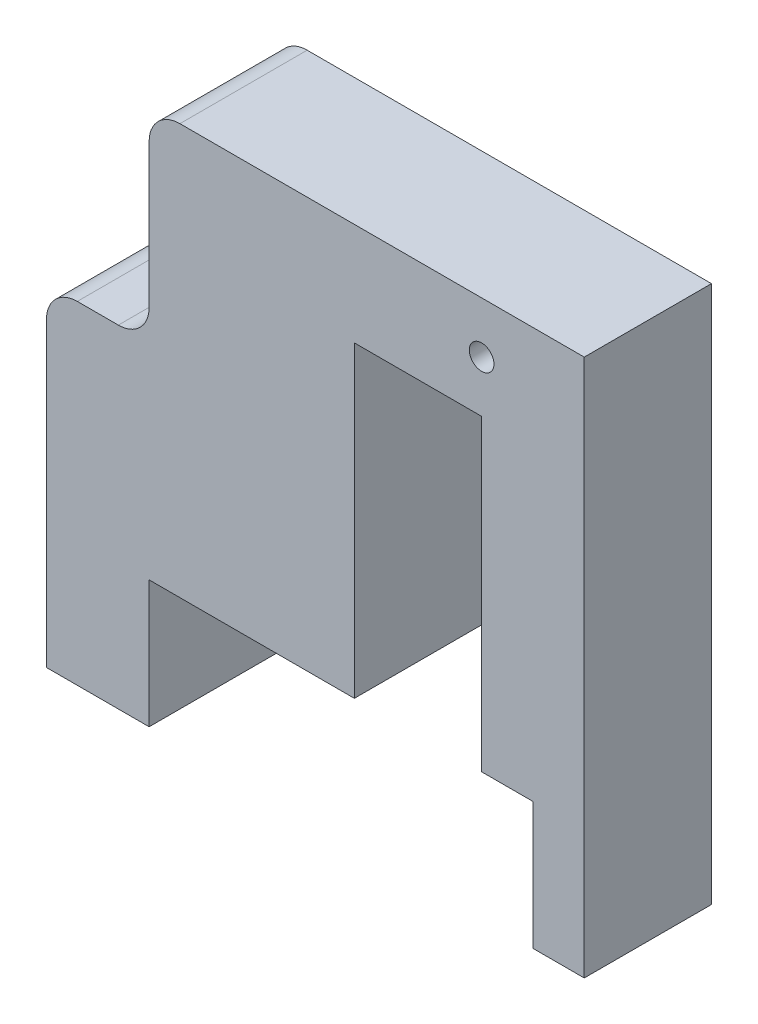
ISO-10303-21;
HEADER;
FILE_DESCRIPTION(('STEP AP214'),'2;1');
FILE_NAME('part.step','',(''),(''),'','','');
FILE_SCHEMA(('AUTOMOTIVE_DESIGN { 1 0 10303 214 1 1 1 1 }'));
ENDSEC;
DATA;
#1=APPLICATION_CONTEXT('core data for automotive mechanical design processes');
#2=APPLICATION_PROTOCOL_DEFINITION('international standard','automotive_design',2000,#1);
#3=PRODUCT_CONTEXT('',#1,'mechanical');
#4=PRODUCT('Part','Part','',(#3));
#5=PRODUCT_RELATED_PRODUCT_CATEGORY('part','',(#4));
#6=PRODUCT_DEFINITION_FORMATION('','',#4);
#7=PRODUCT_DEFINITION_CONTEXT('part definition',#1,'design');
#8=PRODUCT_DEFINITION('design','',#6,#7);
#9=PRODUCT_DEFINITION_SHAPE('','',#8);
#10=(LENGTH_UNIT() NAMED_UNIT(*) SI_UNIT(.MILLI.,.METRE.));
#11=(NAMED_UNIT(*) PLANE_ANGLE_UNIT() SI_UNIT($,.RADIAN.));
#12=(NAMED_UNIT(*) SI_UNIT($,.STERADIAN.) SOLID_ANGLE_UNIT());
#13=UNCERTAINTY_MEASURE_WITH_UNIT(LENGTH_MEASURE(1.E-05),#10,'distance_accuracy_value','');
#14=(GEOMETRIC_REPRESENTATION_CONTEXT(3) GLOBAL_UNCERTAINTY_ASSIGNED_CONTEXT((#13)) GLOBAL_UNIT_ASSIGNED_CONTEXT((#10,
#11,#12)) REPRESENTATION_CONTEXT('',''));
#15=CARTESIAN_POINT('',(0.,0.,0.));
#16=DIRECTION('',(0.,0.,1.));
#17=DIRECTION('',(1.,0.,0.));
#18=AXIS2_PLACEMENT_3D('',#15,#16,#17);
#19=CARTESIAN_POINT('',(3.,29.4,12.4));
#20=DIRECTION('',(0.,0.,1.));
#21=DIRECTION('',(1.,0.,0.));
#22=AXIS2_PLACEMENT_3D('',#19,#20,#21);
#23=PLANE('',#22);
#24=DIRECTION('',(0.,-1.,0.));
#25=VECTOR('',#24,1.);
#26=CARTESIAN_POINT('',(0.,0.,12.4));
#27=LINE('',#26,#25);
#28=CARTESIAN_POINT('',(0.,29.4,12.4));
#29=VERTEX_POINT('',#28);
#30=CARTESIAN_POINT('',(0.,0.,12.4));
#31=VERTEX_POINT('',#30);
#32=EDGE_CURVE('E217',#29,#31,#27,.T.);
#33=ORIENTED_EDGE('',*,*,#32,.T.);
#34=DIRECTION('',(1.,0.,0.));
#35=VECTOR('',#34,1.);
#36=CARTESIAN_POINT('',(0.,0.,12.4));
#37=LINE('',#36,#35);
#38=CARTESIAN_POINT('',(10.,0.,12.4));
#39=VERTEX_POINT('',#38);
#40=EDGE_CURVE('E120',#31,#39,#37,.T.);
#41=ORIENTED_EDGE('',*,*,#40,.T.);
#42=DIRECTION('',(0.,1.,0.));
#43=VECTOR('',#42,1.);
#44=CARTESIAN_POINT('',(10.,0.,12.4));
#45=LINE('',#44,#43);
#46=CARTESIAN_POINT('',(10.,12.4,12.4));
#47=VERTEX_POINT('',#46);
#48=EDGE_CURVE('E259',#39,#47,#45,.T.);
#49=ORIENTED_EDGE('',*,*,#48,.T.);
#50=DIRECTION('',(1.,0.,0.));
#51=VECTOR('',#50,1.);
#52=CARTESIAN_POINT('',(10.,12.4,12.4));
#53=LINE('',#52,#51);
#54=CARTESIAN_POINT('',(30.,12.4,12.4));
#55=VERTEX_POINT('',#54);
#56=EDGE_CURVE('E278',#47,#55,#53,.T.);
#57=ORIENTED_EDGE('',*,*,#56,.T.);
#58=DIRECTION('',(0.,1.,0.));
#59=VECTOR('',#58,1.);
#60=CARTESIAN_POINT('',(30.,12.4,12.4));
#61=LINE('',#60,#59);
#62=CARTESIAN_POINT('',(30.,42.4,12.4));
#63=VERTEX_POINT('',#62);
#64=EDGE_CURVE('E275',#55,#63,#61,.T.);
#65=ORIENTED_EDGE('',*,*,#64,.T.);
#66=DIRECTION('',(1.,0.,0.));
#67=VECTOR('',#66,1.);
#68=CARTESIAN_POINT('',(30.,42.4,12.4));
#69=LINE('',#68,#67);
#70=CARTESIAN_POINT('',(42.4,42.4,12.4));
#71=VERTEX_POINT('',#70);
#72=EDGE_CURVE('E277',#63,#71,#69,.T.);
#73=ORIENTED_EDGE('',*,*,#72,.T.);
#74=DIRECTION('',(0.,-1.,0.));
#75=VECTOR('',#74,1.);
#76=CARTESIAN_POINT('',(42.4,12.4,12.4));
#77=LINE('',#76,#75);
#78=CARTESIAN_POINT('',(42.4,12.4,12.4));
#79=VERTEX_POINT('',#78);
#80=EDGE_CURVE('E280',#71,#79,#77,.T.);
#81=ORIENTED_EDGE('',*,*,#80,.T.);
#82=DIRECTION('',(1.,0.,0.));
#83=VECTOR('',#82,1.);
#84=CARTESIAN_POINT('',(42.4,12.4,12.4));
#85=LINE('',#84,#83);
#86=CARTESIAN_POINT('',(47.4,12.4,12.4));
#87=VERTEX_POINT('',#86);
#88=EDGE_CURVE('E286',#79,#87,#85,.T.);
#89=ORIENTED_EDGE('',*,*,#88,.T.);
#90=DIRECTION('',(0.,-1.,0.));
#91=VECTOR('',#90,1.);
#92=CARTESIAN_POINT('',(47.4,0.,12.4));
#93=LINE('',#92,#91);
#94=CARTESIAN_POINT('',(47.4,0.,12.4));
#95=VERTEX_POINT('',#94);
#96=EDGE_CURVE('E288',#87,#95,#93,.T.);
#97=ORIENTED_EDGE('',*,*,#96,.T.);
#98=DIRECTION('',(1.,0.,0.));
#99=VECTOR('',#98,1.);
#100=CARTESIAN_POINT('',(47.4,0.,12.4));
#101=LINE('',#100,#99);
#102=CARTESIAN_POINT('',(52.4,0.,12.4));
#103=VERTEX_POINT('',#102);
#104=EDGE_CURVE('E290',#95,#103,#101,.T.);
#105=ORIENTED_EDGE('',*,*,#104,.T.);
#106=DIRECTION('',(0.,1.,0.));
#107=VECTOR('',#106,1.);
#108=CARTESIAN_POINT('',(52.4,0.,12.4));
#109=LINE('',#108,#107);
#110=CARTESIAN_POINT('',(52.4,52.4,12.4));
#111=VERTEX_POINT('',#110);
#112=EDGE_CURVE('E292',#103,#111,#109,.T.);
#113=ORIENTED_EDGE('',*,*,#112,.T.);
#114=DIRECTION('',(-1.,0.,0.));
#115=VECTOR('',#114,1.);
#116=CARTESIAN_POINT('',(13.,52.4,12.4));
#117=LINE('',#116,#115);
#118=CARTESIAN_POINT('',(13.,52.4,12.4));
#119=VERTEX_POINT('',#118);
#120=EDGE_CURVE('E294',#111,#119,#117,.T.);
#121=ORIENTED_EDGE('',*,*,#120,.T.);
#122=CARTESIAN_POINT('',(13.,49.4,12.4));
#123=DIRECTION('',(0.,0.,1.));
#124=DIRECTION('',(1.,0.,0.));
#125=AXIS2_PLACEMENT_3D('',#122,#123,#124);
#126=CIRCLE('',#125,3.);
#127=CARTESIAN_POINT('',(10.,49.4,12.4));
#128=VERTEX_POINT('',#127);
#129=EDGE_CURVE('E296',#119,#128,#126,.T.);
#130=ORIENTED_EDGE('',*,*,#129,.T.);
#131=DIRECTION('',(0.,-1.,0.));
#132=VECTOR('',#131,1.);
#133=CARTESIAN_POINT('',(10.,49.4,12.4));
#134=LINE('',#133,#132);
#135=CARTESIAN_POINT('',(10.,35.4,12.4));
#136=VERTEX_POINT('',#135);
#137=EDGE_CURVE('E166',#128,#136,#134,.T.);
#138=ORIENTED_EDGE('',*,*,#137,.T.);
#139=CARTESIAN_POINT('',(7.,35.4,12.4));
#140=DIRECTION('',(0.,0.,-1.));
#141=DIRECTION('',(1.,0.,0.));
#142=AXIS2_PLACEMENT_3D('',#139,#140,#141);
#143=CIRCLE('',#142,3.);
#144=CARTESIAN_POINT('',(7.,32.4,12.4));
#145=VERTEX_POINT('',#144);
#146=EDGE_CURVE('E160',#136,#145,#143,.T.);
#147=ORIENTED_EDGE('',*,*,#146,.T.);
#148=DIRECTION('',(-1.,0.,0.));
#149=VECTOR('',#148,1.);
#150=CARTESIAN_POINT('',(3.,32.4,12.4));
#151=LINE('',#150,#149);
#152=CARTESIAN_POINT('',(3.,32.4,12.4));
#153=VERTEX_POINT('',#152);
#154=EDGE_CURVE('E164',#145,#153,#151,.T.);
#155=ORIENTED_EDGE('',*,*,#154,.T.);
#156=CARTESIAN_POINT('',(3.,29.4,12.4));
#157=DIRECTION('',(0.,0.,1.));
#158=DIRECTION('',(1.,0.,0.));
#159=AXIS2_PLACEMENT_3D('',#156,#157,#158);
#160=CIRCLE('',#159,3.);
#161=EDGE_CURVE('E50',#153,#29,#160,.T.);
#162=ORIENTED_EDGE('',*,*,#161,.T.);
#163=EDGE_LOOP('',(#33,#41,#49,#57,#65,#73,#81,#89,#97,#105,#113,#121,#130,#138,#147,#155,#162));
#164=FACE_BOUND('',#163,.T.);
#165=CARTESIAN_POINT('',(42.4,47.4,12.4));
#166=DIRECTION('',(0.,0.,1.));
#167=DIRECTION('',(1.,0.,0.));
#168=AXIS2_PLACEMENT_3D('',#165,#166,#167);
#169=CIRCLE('',#168,1.19999999999998);
#170=CARTESIAN_POINT('',(41.2,47.4,12.4));
#171=VERTEX_POINT('',#170);
#172=EDGE_CURVE('E188',#171,#171,#169,.T.);
#173=ORIENTED_EDGE('',*,*,#172,.F.);
#174=EDGE_LOOP('',(#173));
#175=FACE_BOUND('',#174,.T.);
#176=ADVANCED_FACE('F33',(#164,#175),#23,.T.);
#177=CARTESIAN_POINT('',(3.,29.4,0.));
#178=DIRECTION('',(0.,0.,1.));
#179=DIRECTION('',(1.,0.,0.));
#180=AXIS2_PLACEMENT_3D('',#177,#178,#179);
#181=PLANE('',#180);
#182=DIRECTION('',(0.,-1.,0.));
#183=VECTOR('',#182,1.);
#184=CARTESIAN_POINT('',(0.,0.,0.));
#185=LINE('',#184,#183);
#186=CARTESIAN_POINT('',(0.,29.4,0.));
#187=VERTEX_POINT('',#186);
#188=CARTESIAN_POINT('',(0.,0.,0.));
#189=VERTEX_POINT('',#188);
#190=EDGE_CURVE('E184',#187,#189,#185,.T.);
#191=ORIENTED_EDGE('',*,*,#190,.F.);
#192=CARTESIAN_POINT('',(3.,29.4,0.));
#193=DIRECTION('',(0.,0.,1.));
#194=DIRECTION('',(1.,0.,0.));
#195=AXIS2_PLACEMENT_3D('',#192,#193,#194);
#196=CIRCLE('',#195,3.);
#197=CARTESIAN_POINT('',(3.,32.4,0.));
#198=VERTEX_POINT('',#197);
#199=EDGE_CURVE('E112',#198,#187,#196,.T.);
#200=ORIENTED_EDGE('',*,*,#199,.F.);
#201=DIRECTION('',(-1.,0.,0.));
#202=VECTOR('',#201,1.);
#203=CARTESIAN_POINT('',(3.,32.4,0.));
#204=LINE('',#203,#202);
#205=CARTESIAN_POINT('',(7.,32.4,0.));
#206=VERTEX_POINT('',#205);
#207=EDGE_CURVE('E106',#206,#198,#204,.T.);
#208=ORIENTED_EDGE('',*,*,#207,.F.);
#209=CARTESIAN_POINT('',(7.,35.4,0.));
#210=DIRECTION('',(0.,0.,-1.));
#211=DIRECTION('',(1.,0.,0.));
#212=AXIS2_PLACEMENT_3D('',#209,#210,#211);
#213=CIRCLE('',#212,3.);
#214=CARTESIAN_POINT('',(10.,35.4,0.));
#215=VERTEX_POINT('',#214);
#216=EDGE_CURVE('E174',#215,#206,#213,.T.);
#217=ORIENTED_EDGE('',*,*,#216,.F.);
#218=DIRECTION('',(0.,-1.,0.));
#219=VECTOR('',#218,1.);
#220=CARTESIAN_POINT('',(10.,49.4,0.));
#221=LINE('',#220,#219);
#222=CARTESIAN_POINT('',(10.,49.4,0.));
#223=VERTEX_POINT('',#222);
#224=EDGE_CURVE('E212',#223,#215,#221,.T.);
#225=ORIENTED_EDGE('',*,*,#224,.F.);
#226=CARTESIAN_POINT('',(13.,49.4,0.));
#227=DIRECTION('',(0.,0.,1.));
#228=DIRECTION('',(1.,0.,0.));
#229=AXIS2_PLACEMENT_3D('',#226,#227,#228);
#230=CIRCLE('',#229,3.);
#231=CARTESIAN_POINT('',(13.,52.4,0.));
#232=VERTEX_POINT('',#231);
#233=EDGE_CURVE('E210',#232,#223,#230,.T.);
#234=ORIENTED_EDGE('',*,*,#233,.F.);
#235=DIRECTION('',(-1.,0.,0.));
#236=VECTOR('',#235,1.);
#237=CARTESIAN_POINT('',(13.,52.4,0.));
#238=LINE('',#237,#236);
#239=CARTESIAN_POINT('',(52.4,52.4,0.));
#240=VERTEX_POINT('',#239);
#241=EDGE_CURVE('E208',#240,#232,#238,.T.);
#242=ORIENTED_EDGE('',*,*,#241,.F.);
#243=DIRECTION('',(0.,1.,0.));
#244=VECTOR('',#243,1.);
#245=CARTESIAN_POINT('',(52.4,0.,0.));
#246=LINE('',#245,#244);
#247=CARTESIAN_POINT('',(52.4,0.,0.));
#248=VERTEX_POINT('',#247);
#249=EDGE_CURVE('E206',#248,#240,#246,.T.);
#250=ORIENTED_EDGE('',*,*,#249,.F.);
#251=DIRECTION('',(1.,0.,0.));
#252=VECTOR('',#251,1.);
#253=CARTESIAN_POINT('',(47.4,0.,0.));
#254=LINE('',#253,#252);
#255=CARTESIAN_POINT('',(47.4,0.,0.));
#256=VERTEX_POINT('',#255);
#257=EDGE_CURVE('E204',#256,#248,#254,.T.);
#258=ORIENTED_EDGE('',*,*,#257,.F.);
#259=DIRECTION('',(0.,-1.,0.));
#260=VECTOR('',#259,1.);
#261=CARTESIAN_POINT('',(47.4,0.,0.));
#262=LINE('',#261,#260);
#263=CARTESIAN_POINT('',(47.4,12.4,0.));
#264=VERTEX_POINT('',#263);
#265=EDGE_CURVE('E202',#264,#256,#262,.T.);
#266=ORIENTED_EDGE('',*,*,#265,.F.);
#267=DIRECTION('',(1.,0.,0.));
#268=VECTOR('',#267,1.);
#269=CARTESIAN_POINT('',(42.4,12.4,0.));
#270=LINE('',#269,#268);
#271=CARTESIAN_POINT('',(42.4,12.4,0.));
#272=VERTEX_POINT('',#271);
#273=EDGE_CURVE('E200',#272,#264,#270,.T.);
#274=ORIENTED_EDGE('',*,*,#273,.F.);
#275=DIRECTION('',(0.,-1.,0.));
#276=VECTOR('',#275,1.);
#277=CARTESIAN_POINT('',(42.4,12.4,0.));
#278=LINE('',#277,#276);
#279=CARTESIAN_POINT('',(42.4,42.4,0.));
#280=VERTEX_POINT('',#279);
#281=EDGE_CURVE('E198',#280,#272,#278,.T.);
#282=ORIENTED_EDGE('',*,*,#281,.F.);
#283=DIRECTION('',(1.,0.,0.));
#284=VECTOR('',#283,1.);
#285=CARTESIAN_POINT('',(30.,42.4,0.));
#286=LINE('',#285,#284);
#287=CARTESIAN_POINT('',(30.,42.4,0.));
#288=VERTEX_POINT('',#287);
#289=EDGE_CURVE('E196',#288,#280,#286,.T.);
#290=ORIENTED_EDGE('',*,*,#289,.F.);
#291=DIRECTION('',(0.,1.,0.));
#292=VECTOR('',#291,1.);
#293=CARTESIAN_POINT('',(30.,12.4,0.));
#294=LINE('',#293,#292);
#295=CARTESIAN_POINT('',(30.,12.4,0.));
#296=VERTEX_POINT('',#295);
#297=EDGE_CURVE('E194',#296,#288,#294,.T.);
#298=ORIENTED_EDGE('',*,*,#297,.F.);
#299=DIRECTION('',(1.,0.,0.));
#300=VECTOR('',#299,1.);
#301=CARTESIAN_POINT('',(10.,12.4,0.));
#302=LINE('',#301,#300);
#303=CARTESIAN_POINT('',(10.,12.4,0.));
#304=VERTEX_POINT('',#303);
#305=EDGE_CURVE('E192',#304,#296,#302,.T.);
#306=ORIENTED_EDGE('',*,*,#305,.F.);
#307=DIRECTION('',(0.,1.,0.));
#308=VECTOR('',#307,1.);
#309=CARTESIAN_POINT('',(10.,0.,0.));
#310=LINE('',#309,#308);
#311=CARTESIAN_POINT('',(10.,0.,0.));
#312=VERTEX_POINT('',#311);
#313=EDGE_CURVE('E190',#312,#304,#310,.T.);
#314=ORIENTED_EDGE('',*,*,#313,.F.);
#315=DIRECTION('',(1.,0.,0.));
#316=VECTOR('',#315,1.);
#317=CARTESIAN_POINT('',(0.,0.,0.));
#318=LINE('',#317,#316);
#319=EDGE_CURVE('E187',#189,#312,#318,.T.);
#320=ORIENTED_EDGE('',*,*,#319,.F.);
#321=EDGE_LOOP('',(#191,#200,#208,#217,#225,#234,#242,#250,#258,#266,#274,#282,#290,#298,#306,
#314,#320));
#322=FACE_BOUND('',#321,.T.);
#323=CARTESIAN_POINT('',(42.4,47.4,0.));
#324=DIRECTION('',(0.,0.,1.));
#325=DIRECTION('',(1.,0.,0.));
#326=AXIS2_PLACEMENT_3D('',#323,#324,#325);
#327=CIRCLE('',#326,1.19999999999998);
#328=CARTESIAN_POINT('',(41.2,47.4,0.));
#329=VERTEX_POINT('',#328);
#330=EDGE_CURVE('E514',#329,#329,#327,.T.);
#331=ORIENTED_EDGE('',*,*,#330,.T.);
#332=EDGE_LOOP('',(#331));
#333=FACE_BOUND('',#332,.T.);
#334=ADVANCED_FACE('F263',(#322,#333),#181,.F.);
#335=CARTESIAN_POINT('',(0.,0.,12.4));
#336=DIRECTION('',(1.,0.,0.));
#337=DIRECTION('',(0.,0.,-1.));
#338=AXIS2_PLACEMENT_3D('',#335,#336,#337);
#339=PLANE('',#338);
#340=ORIENTED_EDGE('',*,*,#190,.T.);
#341=DIRECTION('',(0.,0.,-1.));
#342=VECTOR('',#341,1.);
#343=CARTESIAN_POINT('',(0.,0.,12.4));
#344=LINE('',#343,#342);
#345=EDGE_CURVE('E11',#31,#189,#344,.T.);
#346=ORIENTED_EDGE('',*,*,#345,.F.);
#347=ORIENTED_EDGE('',*,*,#32,.F.);
#348=DIRECTION('',(0.,0.,-1.));
#349=VECTOR('',#348,1.);
#350=CARTESIAN_POINT('',(0.,29.4,12.4));
#351=LINE('',#350,#349);
#352=EDGE_CURVE('E180',#29,#187,#351,.T.);
#353=ORIENTED_EDGE('',*,*,#352,.T.);
#354=EDGE_LOOP('',(#340,#346,#347,#353));
#355=FACE_BOUND('',#354,.T.);
#356=ADVANCED_FACE('F35',(#355),#339,.F.);
#357=CARTESIAN_POINT('',(0.,0.,12.4));
#358=DIRECTION('',(0.,1.,0.));
#359=DIRECTION('',(0.,0.,1.));
#360=AXIS2_PLACEMENT_3D('',#357,#358,#359);
#361=PLANE('',#360);
#362=ORIENTED_EDGE('',*,*,#319,.T.);
#363=DIRECTION('',(0.,0.,-1.));
#364=VECTOR('',#363,1.);
#365=CARTESIAN_POINT('',(10.,0.,12.4));
#366=LINE('',#365,#364);
#367=EDGE_CURVE('E42',#39,#312,#366,.T.);
#368=ORIENTED_EDGE('',*,*,#367,.F.);
#369=ORIENTED_EDGE('',*,*,#40,.F.);
#370=ORIENTED_EDGE('',*,*,#345,.T.);
#371=EDGE_LOOP('',(#362,#368,#369,#370));
#372=FACE_BOUND('',#371,.T.);
#373=ADVANCED_FACE('F330',(#372),#361,.F.);
#374=CARTESIAN_POINT('',(10.,0.,12.4));
#375=DIRECTION('',(-1.,0.,0.));
#376=DIRECTION('',(0.,0.,1.));
#377=AXIS2_PLACEMENT_3D('',#374,#375,#376);
#378=PLANE('',#377);
#379=ORIENTED_EDGE('',*,*,#313,.T.);
#380=DIRECTION('',(0.,0.,-1.));
#381=VECTOR('',#380,1.);
#382=CARTESIAN_POINT('',(10.,12.4,12.4));
#383=LINE('',#382,#381);
#384=EDGE_CURVE('E251',#47,#304,#383,.T.);
#385=ORIENTED_EDGE('',*,*,#384,.F.);
#386=ORIENTED_EDGE('',*,*,#48,.F.);
#387=ORIENTED_EDGE('',*,*,#367,.T.);
#388=EDGE_LOOP('',(#379,#385,#386,#387));
#389=FACE_BOUND('',#388,.T.);
#390=ADVANCED_FACE('F257',(#389),#378,.F.);
#391=CARTESIAN_POINT('',(10.,12.4,12.4));
#392=DIRECTION('',(0.,1.,0.));
#393=DIRECTION('',(0.,0.,1.));
#394=AXIS2_PLACEMENT_3D('',#391,#392,#393);
#395=PLANE('',#394);
#396=ORIENTED_EDGE('',*,*,#305,.T.);
#397=DIRECTION('',(0.,0.,-1.));
#398=VECTOR('',#397,1.);
#399=CARTESIAN_POINT('',(30.,12.4,12.4));
#400=LINE('',#399,#398);
#401=EDGE_CURVE('E248',#55,#296,#400,.T.);
#402=ORIENTED_EDGE('',*,*,#401,.F.);
#403=ORIENTED_EDGE('',*,*,#56,.F.);
#404=ORIENTED_EDGE('',*,*,#384,.T.);
#405=EDGE_LOOP('',(#396,#402,#403,#404));
#406=FACE_BOUND('',#405,.T.);
#407=ADVANCED_FACE('F269',(#406),#395,.F.);
#408=CARTESIAN_POINT('',(30.,12.4,12.4));
#409=DIRECTION('',(-1.,0.,0.));
#410=DIRECTION('',(0.,-1.,0.));
#411=AXIS2_PLACEMENT_3D('',#408,#409,#410);
#412=PLANE('',#411);
#413=ORIENTED_EDGE('',*,*,#297,.T.);
#414=DIRECTION('',(0.,0.,-1.));
#415=VECTOR('',#414,1.);
#416=CARTESIAN_POINT('',(30.,42.4,12.4));
#417=LINE('',#416,#415);
#418=EDGE_CURVE('E245',#63,#288,#417,.T.);
#419=ORIENTED_EDGE('',*,*,#418,.F.);
#420=ORIENTED_EDGE('',*,*,#64,.F.);
#421=ORIENTED_EDGE('',*,*,#401,.T.);
#422=EDGE_LOOP('',(#413,#419,#420,#421));
#423=FACE_BOUND('',#422,.T.);
#424=ADVANCED_FACE('F273',(#423),#412,.F.);
#425=CARTESIAN_POINT('',(30.,42.4,12.4));
#426=DIRECTION('',(0.,1.,0.));
#427=DIRECTION('',(0.,0.,1.));
#428=AXIS2_PLACEMENT_3D('',#425,#426,#427);
#429=PLANE('',#428);
#430=ORIENTED_EDGE('',*,*,#289,.T.);
#431=DIRECTION('',(0.,0.,-1.));
#432=VECTOR('',#431,1.);
#433=CARTESIAN_POINT('',(42.4,42.4,12.4));
#434=LINE('',#433,#432);
#435=EDGE_CURVE('E242',#71,#280,#434,.T.);
#436=ORIENTED_EDGE('',*,*,#435,.F.);
#437=ORIENTED_EDGE('',*,*,#72,.F.);
#438=ORIENTED_EDGE('',*,*,#418,.T.);
#439=EDGE_LOOP('',(#430,#436,#437,#438));
#440=FACE_BOUND('',#439,.T.);
#441=ADVANCED_FACE('F343',(#440),#429,.F.);
#442=CARTESIAN_POINT('',(42.4,12.4,12.4));
#443=DIRECTION('',(1.,0.,0.));
#444=DIRECTION('',(0.,0.,-1.));
#445=AXIS2_PLACEMENT_3D('',#442,#443,#444);
#446=PLANE('',#445);
#447=ORIENTED_EDGE('',*,*,#281,.T.);
#448=DIRECTION('',(0.,0.,-1.));
#449=VECTOR('',#448,1.);
#450=CARTESIAN_POINT('',(42.4,12.4,12.4));
#451=LINE('',#450,#449);
#452=EDGE_CURVE('E239',#79,#272,#451,.T.);
#453=ORIENTED_EDGE('',*,*,#452,.F.);
#454=ORIENTED_EDGE('',*,*,#80,.F.);
#455=ORIENTED_EDGE('',*,*,#435,.T.);
#456=EDGE_LOOP('',(#447,#453,#454,#455));
#457=FACE_BOUND('',#456,.T.);
#458=ADVANCED_FACE('F346',(#457),#446,.F.);
#459=CARTESIAN_POINT('',(42.4,12.4,12.4));
#460=DIRECTION('',(0.,1.,0.));
#461=DIRECTION('',(0.,0.,1.));
#462=AXIS2_PLACEMENT_3D('',#459,#460,#461);
#463=PLANE('',#462);
#464=ORIENTED_EDGE('',*,*,#273,.T.);
#465=DIRECTION('',(0.,0.,-1.));
#466=VECTOR('',#465,1.);
#467=CARTESIAN_POINT('',(47.4,12.4,12.4));
#468=LINE('',#467,#466);
#469=EDGE_CURVE('E236',#87,#264,#468,.T.);
#470=ORIENTED_EDGE('',*,*,#469,.F.);
#471=ORIENTED_EDGE('',*,*,#88,.F.);
#472=ORIENTED_EDGE('',*,*,#452,.T.);
#473=EDGE_LOOP('',(#464,#470,#471,#472));
#474=FACE_BOUND('',#473,.T.);
#475=ADVANCED_FACE('F350',(#474),#463,.F.);
#476=CARTESIAN_POINT('',(47.4,0.,12.4));
#477=DIRECTION('',(1.,0.,0.));
#478=DIRECTION('',(0.,0.,-1.));
#479=AXIS2_PLACEMENT_3D('',#476,#477,#478);
#480=PLANE('',#479);
#481=ORIENTED_EDGE('',*,*,#265,.T.);
#482=DIRECTION('',(0.,0.,-1.));
#483=VECTOR('',#482,1.);
#484=CARTESIAN_POINT('',(47.4,0.,12.4));
#485=LINE('',#484,#483);
#486=EDGE_CURVE('E233',#95,#256,#485,.T.);
#487=ORIENTED_EDGE('',*,*,#486,.F.);
#488=ORIENTED_EDGE('',*,*,#96,.F.);
#489=ORIENTED_EDGE('',*,*,#469,.T.);
#490=EDGE_LOOP('',(#481,#487,#488,#489));
#491=FACE_BOUND('',#490,.T.);
#492=ADVANCED_FACE('F354',(#491),#480,.F.);
#493=CARTESIAN_POINT('',(47.4,0.,12.4));
#494=DIRECTION('',(0.,1.,0.));
#495=DIRECTION('',(0.,0.,1.));
#496=AXIS2_PLACEMENT_3D('',#493,#494,#495);
#497=PLANE('',#496);
#498=ORIENTED_EDGE('',*,*,#257,.T.);
#499=DIRECTION('',(0.,0.,-1.));
#500=VECTOR('',#499,1.);
#501=CARTESIAN_POINT('',(52.4,0.,12.4));
#502=LINE('',#501,#500);
#503=EDGE_CURVE('E230',#103,#248,#502,.T.);
#504=ORIENTED_EDGE('',*,*,#503,.F.);
#505=ORIENTED_EDGE('',*,*,#104,.F.);
#506=ORIENTED_EDGE('',*,*,#486,.T.);
#507=EDGE_LOOP('',(#498,#504,#505,#506));
#508=FACE_BOUND('',#507,.T.);
#509=ADVANCED_FACE('F358',(#508),#497,.F.);
#510=CARTESIAN_POINT('',(52.4,0.,12.4));
#511=DIRECTION('',(-1.,0.,0.));
#512=DIRECTION('',(0.,0.,1.));
#513=AXIS2_PLACEMENT_3D('',#510,#511,#512);
#514=PLANE('',#513);
#515=ORIENTED_EDGE('',*,*,#249,.T.);
#516=DIRECTION('',(0.,0.,-1.));
#517=VECTOR('',#516,1.);
#518=CARTESIAN_POINT('',(52.4,52.4,12.4));
#519=LINE('',#518,#517);
#520=EDGE_CURVE('E227',#111,#240,#519,.T.);
#521=ORIENTED_EDGE('',*,*,#520,.F.);
#522=ORIENTED_EDGE('',*,*,#112,.F.);
#523=ORIENTED_EDGE('',*,*,#503,.T.);
#524=EDGE_LOOP('',(#515,#521,#522,#523));
#525=FACE_BOUND('',#524,.T.);
#526=ADVANCED_FACE('F362',(#525),#514,.F.);
#527=CARTESIAN_POINT('',(13.,52.4,12.4));
#528=DIRECTION('',(0.,-1.,0.));
#529=DIRECTION('',(0.,0.,-1.));
#530=AXIS2_PLACEMENT_3D('',#527,#528,#529);
#531=PLANE('',#530);
#532=ORIENTED_EDGE('',*,*,#241,.T.);
#533=DIRECTION('',(0.,0.,-1.));
#534=VECTOR('',#533,1.);
#535=CARTESIAN_POINT('',(13.,52.4,12.4));
#536=LINE('',#535,#534);
#537=EDGE_CURVE('E224',#119,#232,#536,.T.);
#538=ORIENTED_EDGE('',*,*,#537,.F.);
#539=ORIENTED_EDGE('',*,*,#120,.F.);
#540=ORIENTED_EDGE('',*,*,#520,.T.);
#541=EDGE_LOOP('',(#532,#538,#539,#540));
#542=FACE_BOUND('',#541,.T.);
#543=ADVANCED_FACE('F366',(#542),#531,.F.);
#544=CARTESIAN_POINT('',(13.,49.4,12.4));
#545=DIRECTION('',(0.,0.,-1.));
#546=DIRECTION('',(-1.,0.,0.));
#547=AXIS2_PLACEMENT_3D('',#544,#545,#546);
#548=CYLINDRICAL_SURFACE('',#547,3.);
#549=ORIENTED_EDGE('',*,*,#233,.T.);
#550=DIRECTION('',(0.,0.,-1.));
#551=VECTOR('',#550,1.);
#552=CARTESIAN_POINT('',(10.,49.4,12.4));
#553=LINE('',#552,#551);
#554=EDGE_CURVE('E221',#128,#223,#553,.T.);
#555=ORIENTED_EDGE('',*,*,#554,.F.);
#556=ORIENTED_EDGE('',*,*,#129,.F.);
#557=ORIENTED_EDGE('',*,*,#537,.T.);
#558=EDGE_LOOP('',(#549,#555,#556,#557));
#559=FACE_BOUND('',#558,.T.);
#560=ADVANCED_FACE('F302',(#559),#548,.T.);
#561=CARTESIAN_POINT('',(10.,49.4,12.4));
#562=DIRECTION('',(1.,0.,0.));
#563=DIRECTION('',(0.,1.,0.));
#564=AXIS2_PLACEMENT_3D('',#561,#562,#563);
#565=PLANE('',#564);
#566=ORIENTED_EDGE('',*,*,#224,.T.);
#567=DIRECTION('',(0.,0.,-1.));
#568=VECTOR('',#567,1.);
#569=CARTESIAN_POINT('',(10.,35.4,12.4));
#570=LINE('',#569,#568);
#571=EDGE_CURVE('E175',#136,#215,#570,.T.);
#572=ORIENTED_EDGE('',*,*,#571,.F.);
#573=ORIENTED_EDGE('',*,*,#137,.F.);
#574=ORIENTED_EDGE('',*,*,#554,.T.);
#575=EDGE_LOOP('',(#566,#572,#573,#574));
#576=FACE_BOUND('',#575,.T.);
#577=ADVANCED_FACE('F306',(#576),#565,.F.);
#578=CARTESIAN_POINT('',(7.,35.4,12.4));
#579=DIRECTION('',(0.,0.,-1.));
#580=DIRECTION('',(-1.,0.,0.));
#581=AXIS2_PLACEMENT_3D('',#578,#579,#580);
#582=CYLINDRICAL_SURFACE('',#581,3.);
#583=ORIENTED_EDGE('',*,*,#216,.T.);
#584=DIRECTION('',(0.,0.,-1.));
#585=VECTOR('',#584,1.);
#586=CARTESIAN_POINT('',(7.,32.4,12.4));
#587=LINE('',#586,#585);
#588=EDGE_CURVE('E171',#145,#206,#587,.T.);
#589=ORIENTED_EDGE('',*,*,#588,.F.);
#590=ORIENTED_EDGE('',*,*,#146,.F.);
#591=ORIENTED_EDGE('',*,*,#571,.T.);
#592=EDGE_LOOP('',(#583,#589,#590,#591));
#593=FACE_BOUND('',#592,.T.);
#594=ADVANCED_FACE('F172',(#593),#582,.F.);
#595=CARTESIAN_POINT('',(3.,32.4,12.4));
#596=DIRECTION('',(0.,-1.,0.));
#597=DIRECTION('',(1.,0.,0.));
#598=AXIS2_PLACEMENT_3D('',#595,#596,#597);
#599=PLANE('',#598);
#600=ORIENTED_EDGE('',*,*,#207,.T.);
#601=DIRECTION('',(0.,0.,-1.));
#602=VECTOR('',#601,1.);
#603=CARTESIAN_POINT('',(3.,32.4,12.4));
#604=LINE('',#603,#602);
#605=EDGE_CURVE('E176',#153,#198,#604,.T.);
#606=ORIENTED_EDGE('',*,*,#605,.F.);
#607=ORIENTED_EDGE('',*,*,#154,.F.);
#608=ORIENTED_EDGE('',*,*,#588,.T.);
#609=EDGE_LOOP('',(#600,#606,#607,#608));
#610=FACE_BOUND('',#609,.T.);
#611=ADVANCED_FACE('F178',(#610),#599,.F.);
#612=CARTESIAN_POINT('',(3.,29.4,12.4));
#613=DIRECTION('',(0.,0.,-1.));
#614=DIRECTION('',(-1.,0.,0.));
#615=AXIS2_PLACEMENT_3D('',#612,#613,#614);
#616=CYLINDRICAL_SURFACE('',#615,3.);
#617=ORIENTED_EDGE('',*,*,#199,.T.);
#618=ORIENTED_EDGE('',*,*,#352,.F.);
#619=ORIENTED_EDGE('',*,*,#161,.F.);
#620=ORIENTED_EDGE('',*,*,#605,.T.);
#621=EDGE_LOOP('',(#617,#618,#619,#620));
#622=FACE_BOUND('',#621,.T.);
#623=ADVANCED_FACE('F310',(#622),#616,.T.);
#624=CARTESIAN_POINT('',(42.4,47.4,12.4));
#625=DIRECTION('',(0.,0.,-1.));
#626=DIRECTION('',(-1.,0.,0.));
#627=AXIS2_PLACEMENT_3D('',#624,#625,#626);
#628=CYLINDRICAL_SURFACE('',#627,1.19999999999998);
#629=CARTESIAN_POINT('',(41.2,47.4,12.4));
#630=CARTESIAN_POINT('',(41.2,47.4,12.2708333333333));
#631=CARTESIAN_POINT('',(41.2,47.4,12.1416666666667));
#632=CARTESIAN_POINT('',(41.2,47.4,11.8833333333333));
#633=CARTESIAN_POINT('',(41.2,47.4,11.7541666666667));
#634=CARTESIAN_POINT('',(41.2,47.4,11.4958333333333));
#635=CARTESIAN_POINT('',(41.2,47.4,11.3666666666667));
#636=CARTESIAN_POINT('',(41.2,47.4,11.1083333333333));
#637=CARTESIAN_POINT('',(41.2,47.4,10.9791666666667));
#638=CARTESIAN_POINT('',(41.2,47.4,10.7208333333333));
#639=CARTESIAN_POINT('',(41.2,47.4,10.5916666666667));
#640=CARTESIAN_POINT('',(41.2,47.4,10.3333333333333));
#641=CARTESIAN_POINT('',(41.2,47.4,10.2041666666667));
#642=CARTESIAN_POINT('',(41.2,47.4,9.94583333333333));
#643=CARTESIAN_POINT('',(41.2,47.4,9.81666666666666));
#644=CARTESIAN_POINT('',(41.2,47.4,9.55833333333333));
#645=CARTESIAN_POINT('',(41.2,47.4,9.42916666666667));
#646=CARTESIAN_POINT('',(41.2,47.4,9.17083333333333));
#647=CARTESIAN_POINT('',(41.2,47.4,9.04166666666666));
#648=CARTESIAN_POINT('',(41.2,47.4,8.78333333333333));
#649=CARTESIAN_POINT('',(41.2,47.4,8.65416666666667));
#650=CARTESIAN_POINT('',(41.2,47.4,8.39583333333333));
#651=CARTESIAN_POINT('',(41.2,47.4,8.26666666666667));
#652=CARTESIAN_POINT('',(41.2,47.4,8.00833333333333));
#653=CARTESIAN_POINT('',(41.2,47.4,7.87916666666667));
#654=CARTESIAN_POINT('',(41.2,47.4,7.62083333333333));
#655=CARTESIAN_POINT('',(41.2,47.4,7.49166666666667));
#656=CARTESIAN_POINT('',(41.2,47.4,7.23333333333333));
#657=CARTESIAN_POINT('',(41.2,47.4,7.10416666666667));
#658=CARTESIAN_POINT('',(41.2,47.4,6.84583333333333));
#659=CARTESIAN_POINT('',(41.2,47.4,6.71666666666667));
#660=CARTESIAN_POINT('',(41.2,47.4,6.45833333333333));
#661=CARTESIAN_POINT('',(41.2,47.4,6.32916666666666));
#662=CARTESIAN_POINT('',(41.2,47.4,6.07083333333333));
#663=CARTESIAN_POINT('',(41.2,47.4,5.94166666666667));
#664=CARTESIAN_POINT('',(41.2,47.4,5.68333333333333));
#665=CARTESIAN_POINT('',(41.2,47.4,5.55416666666667));
#666=CARTESIAN_POINT('',(41.2,47.4,5.29583333333333));
#667=CARTESIAN_POINT('',(41.2,47.4,5.16666666666667));
#668=CARTESIAN_POINT('',(41.2,47.4,4.90833333333333));
#669=CARTESIAN_POINT('',(41.2,47.4,4.77916666666667));
#670=CARTESIAN_POINT('',(41.2,47.4,4.52083333333333));
#671=CARTESIAN_POINT('',(41.2,47.4,4.39166666666667));
#672=CARTESIAN_POINT('',(41.2,47.4,4.13333333333333));
#673=CARTESIAN_POINT('',(41.2,47.4,4.00416666666667));
#674=CARTESIAN_POINT('',(41.2,47.4,3.74583333333333));
#675=CARTESIAN_POINT('',(41.2,47.4,3.61666666666667));
#676=CARTESIAN_POINT('',(41.2,47.4,3.35833333333333));
#677=CARTESIAN_POINT('',(41.2,47.4,3.22916666666667));
#678=CARTESIAN_POINT('',(41.2,47.4,2.97083333333333));
#679=CARTESIAN_POINT('',(41.2,47.4,2.84166666666667));
#680=CARTESIAN_POINT('',(41.2,47.4,2.58333333333333));
#681=CARTESIAN_POINT('',(41.2,47.4,2.45416666666667));
#682=CARTESIAN_POINT('',(41.2,47.4,2.19583333333333));
#683=CARTESIAN_POINT('',(41.2,47.4,2.06666666666667));
#684=CARTESIAN_POINT('',(41.2,47.4,1.80833333333333));
#685=CARTESIAN_POINT('',(41.2,47.4,1.67916666666667));
#686=CARTESIAN_POINT('',(41.2,47.4,1.42083333333333));
#687=CARTESIAN_POINT('',(41.2,47.4,1.29166666666667));
#688=CARTESIAN_POINT('',(41.2,47.4,1.03333333333333));
#689=CARTESIAN_POINT('',(41.2,47.4,0.904166666666667));
#690=CARTESIAN_POINT('',(41.2,47.4,0.645833333333333));
#691=CARTESIAN_POINT('',(41.2,47.4,0.516666666666667));
#692=CARTESIAN_POINT('',(41.2,47.4,0.258333333333334));
#693=CARTESIAN_POINT('',(41.2,47.4,0.129166666666667));
#694=CARTESIAN_POINT('',(41.2,47.4,0.));
#695=B_SPLINE_CURVE_WITH_KNOTS('',3,(#629,#630,#631,#632,#633,#634,#635,#636,#637,#638,#639,
#640,#641,#642,#643,#644,#645,#646,#647,#648,#649,#650,#651,#652,#653,#654,#655,#656,#657,#658,
#659,#660,#661,#662,#663,#664,#665,#666,#667,#668,#669,#670,#671,#672,#673,#674,#675,#676,#677,
#678,#679,#680,#681,#682,#683,#684,#685,#686,#687,#688,#689,#690,#691,#692,#693,#694),
.UNSPECIFIED.,.F.,.F.,(4,2,2,2,2,2,2,2,2,2,2,2,2,2,2,2,2,2,2,2,2,2,2,2,2,2,2,2,2,2,2,2,4),(0.,
0.387500000000001,0.775000000000001,1.1625,1.55,1.9375,2.325,2.7125,3.1,3.4875,3.875,4.2625,
4.65,5.0375,5.425,5.8125,6.2,6.5875,6.975,7.3625,7.75,8.1375,8.525,8.9125,9.3,9.6875,10.075,
10.4625,10.85,11.2375,11.625,12.0125,12.4),.UNSPECIFIED.);
#696=EDGE_CURVE('BSEAM312',#171,#329,#695,.T.);
#697=ORIENTED_EDGE('',*,*,#172,.T.);
#698=ORIENTED_EDGE('',*,*,#330,.F.);
#699=ORIENTED_EDGE('',*,*,#696,.T.);
#700=ORIENTED_EDGE('',*,*,#696,.F.);
#701=EDGE_LOOP('',(#697,#699,#698,#700));
#702=FACE_BOUND('',#701,.T.);
#703=ADVANCED_FACE('F312',(#702),#628,.F.);
#704=CLOSED_SHELL('',(#176,#334,#356,#373,#390,#407,#424,#441,#458,#475,#492,#509,#526,#543,
#560,#577,#594,#611,#623,#703));
#705=MANIFOLD_SOLID_BREP('B2',#704);
#706=ADVANCED_BREP_SHAPE_REPRESENTATION('',(#18,#705),#14);
#707=SHAPE_DEFINITION_REPRESENTATION(#9,#706);
ENDSEC;
END-ISO-10303-21;
